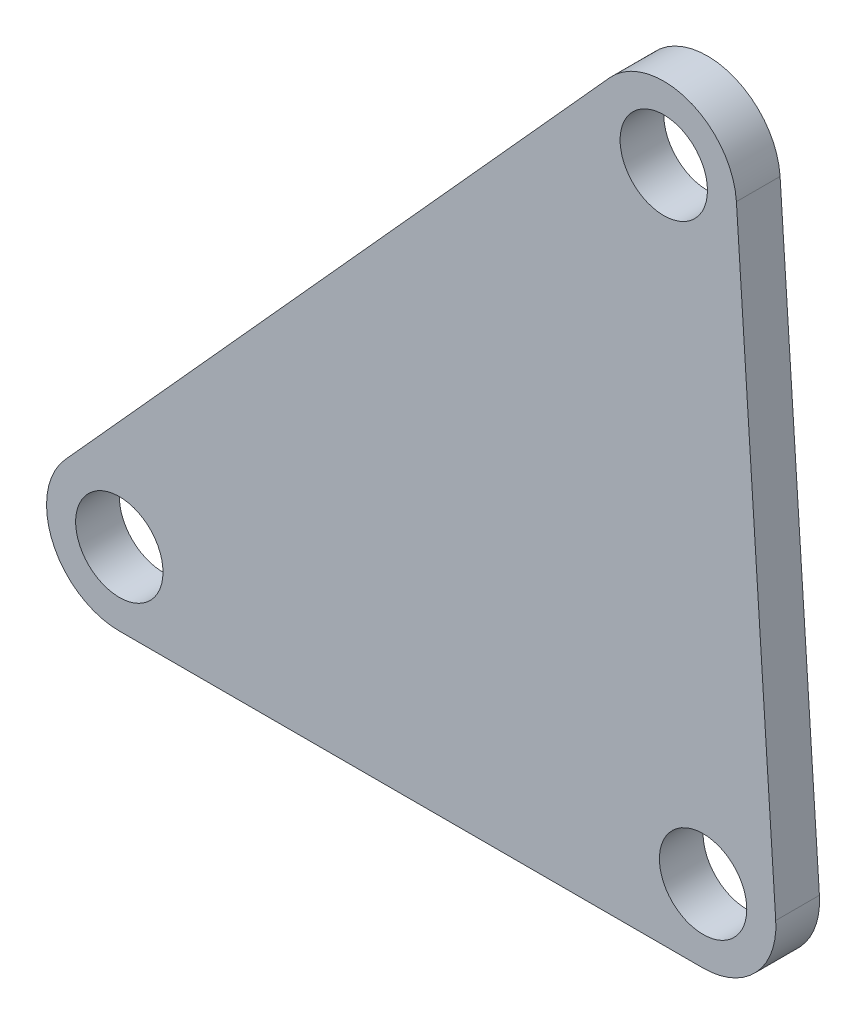
ISO-10303-21;
HEADER;
FILE_DESCRIPTION(('STEP AP214'),'2;1');
FILE_NAME('part.step','',(''),(''),'','','');
FILE_SCHEMA(('AUTOMOTIVE_DESIGN { 1 0 10303 214 1 1 1 1 }'));
ENDSEC;
DATA;
#1=APPLICATION_CONTEXT('core data for automotive mechanical design processes');
#2=APPLICATION_PROTOCOL_DEFINITION('international standard','automotive_design',2000,#1);
#3=PRODUCT_CONTEXT('',#1,'mechanical');
#4=PRODUCT('Part','Part','',(#3));
#5=PRODUCT_RELATED_PRODUCT_CATEGORY('part','',(#4));
#6=PRODUCT_DEFINITION_FORMATION('','',#4);
#7=PRODUCT_DEFINITION_CONTEXT('part definition',#1,'design');
#8=PRODUCT_DEFINITION('design','',#6,#7);
#9=PRODUCT_DEFINITION_SHAPE('','',#8);
#10=(LENGTH_UNIT() NAMED_UNIT(*) SI_UNIT(.MILLI.,.METRE.));
#11=(NAMED_UNIT(*) PLANE_ANGLE_UNIT() SI_UNIT($,.RADIAN.));
#12=(NAMED_UNIT(*) SI_UNIT($,.STERADIAN.) SOLID_ANGLE_UNIT());
#13=UNCERTAINTY_MEASURE_WITH_UNIT(LENGTH_MEASURE(1.E-05),#10,'distance_accuracy_value','');
#14=(GEOMETRIC_REPRESENTATION_CONTEXT(3) GLOBAL_UNCERTAINTY_ASSIGNED_CONTEXT((#13)) GLOBAL_UNIT_ASSIGNED_CONTEXT((#10,
#11,#12)) REPRESENTATION_CONTEXT('',''));
#15=CARTESIAN_POINT('',(0.,0.,0.));
#16=DIRECTION('',(0.,0.,1.));
#17=DIRECTION('',(1.,0.,0.));
#18=AXIS2_PLACEMENT_3D('',#15,#16,#17);
#19=CARTESIAN_POINT('',(0.,0.,3.));
#20=DIRECTION('',(0.,0.,-1.));
#21=DIRECTION('',(-1.,0.,0.));
#22=AXIS2_PLACEMENT_3D('',#19,#20,#21);
#23=PLANE('',#22);
#24=DIRECTION('',(1.,0.,0.));
#25=VECTOR('',#24,1.);
#26=CARTESIAN_POINT('',(-51.3526536867669,-5.00000000000001,3.));
#27=LINE('',#26,#25);
#28=CARTESIAN_POINT('',(-40.1,-5.00000000000001,3.));
#29=VERTEX_POINT('',#28);
#30=CARTESIAN_POINT('',(0.,-5.00000000000001,3.));
#31=VERTEX_POINT('',#30);
#32=EDGE_CURVE('E121',#29,#31,#27,.T.);
#33=ORIENTED_EDGE('',*,*,#32,.T.);
#34=CARTESIAN_POINT('',(0.,0.,3.));
#35=DIRECTION('',(0.,0.,-1.));
#36=DIRECTION('',(-1.,0.,0.));
#37=AXIS2_PLACEMENT_3D('',#34,#35,#36);
#38=CIRCLE('',#37,5.);
#39=CARTESIAN_POINT('',(4.98939885370401,0.325421386293294,3.));
#40=VERTEX_POINT('',#39);
#41=EDGE_CURVE('E134',#31,#40,#38,.F.);
#42=ORIENTED_EDGE('',*,*,#41,.T.);
#43=DIRECTION('',(-0.065084277258661,0.997879770740803,0.));
#44=VECTOR('',#43,1.);
#45=CARTESIAN_POINT('',(5.33673649115046,-5.00000000000001,3.));
#46=LINE('',#45,#44);
#47=CARTESIAN_POINT('',(2.28840134746958,41.7374318720366,3.));
#48=VERTEX_POINT('',#47);
#49=EDGE_CURVE('E105',#40,#48,#46,.T.);
#50=ORIENTED_EDGE('',*,*,#49,.T.);
#51=CARTESIAN_POINT('',(-2.70099750623444,41.4120104857433,3.));
#52=DIRECTION('',(0.,0.,-1.));
#53=DIRECTION('',(-1.,0.,0.));
#54=AXIS2_PLACEMENT_3D('',#51,#52,#53);
#55=CIRCLE('',#54,5.);
#56=CARTESIAN_POINT('',(-6.41175113398921,44.763175583751,3.));
#57=VERTEX_POINT('',#56);
#58=EDGE_CURVE('E53',#48,#57,#55,.F.);
#59=ORIENTED_EDGE('',*,*,#58,.T.);
#60=DIRECTION('',(-0.670233019601534,-0.742150725550956,0.));
#61=VECTOR('',#60,1.);
#62=CARTESIAN_POINT('',(1.51833495747202,53.5441800618031,3.));
#63=LINE('',#62,#61);
#64=CARTESIAN_POINT('',(-43.8107536277548,3.35116509800766,3.));
#65=VERTEX_POINT('',#64);
#66=EDGE_CURVE('E141',#57,#65,#63,.T.);
#67=ORIENTED_EDGE('',*,*,#66,.T.);
#68=CARTESIAN_POINT('',(-40.1,0.,3.));
#69=DIRECTION('',(0.,0.,-1.));
#70=DIRECTION('',(-1.,0.,0.));
#71=AXIS2_PLACEMENT_3D('',#68,#69,#70);
#72=CIRCLE('',#71,5.);
#73=EDGE_CURVE('E131',#65,#29,#72,.F.);
#74=ORIENTED_EDGE('',*,*,#73,.T.);
#75=EDGE_LOOP('',(#33,#42,#50,#59,#67,#74));
#76=FACE_BOUND('',#75,.T.);
#77=CARTESIAN_POINT('',(-2.70099750623443,41.4120104857433,3.));
#78=DIRECTION('',(0.,0.,1.));
#79=DIRECTION('',(1.,0.,0.));
#80=AXIS2_PLACEMENT_3D('',#77,#78,#79);
#81=CIRCLE('',#80,3.);
#82=CARTESIAN_POINT('',(0.299002493765577,41.4120104857433,3.));
#83=VERTEX_POINT('',#82);
#84=EDGE_CURVE('E113',#83,#83,#81,.T.);
#85=ORIENTED_EDGE('',*,*,#84,.F.);
#86=EDGE_LOOP('',(#85));
#87=FACE_BOUND('',#86,.T.);
#88=CARTESIAN_POINT('',(-40.1,0.,3.));
#89=DIRECTION('',(0.,0.,1.));
#90=DIRECTION('',(1.,0.,0.));
#91=AXIS2_PLACEMENT_3D('',#88,#89,#90);
#92=CIRCLE('',#91,3.00000000000001);
#93=CARTESIAN_POINT('',(-37.1,0.,3.));
#94=VERTEX_POINT('',#93);
#95=EDGE_CURVE('E145',#94,#94,#92,.T.);
#96=ORIENTED_EDGE('',*,*,#95,.F.);
#97=EDGE_LOOP('',(#96));
#98=FACE_BOUND('',#97,.T.);
#99=CARTESIAN_POINT('',(0.,0.,3.));
#100=DIRECTION('',(0.,0.,1.));
#101=DIRECTION('',(1.,0.,0.));
#102=AXIS2_PLACEMENT_3D('',#99,#100,#101);
#103=CIRCLE('',#102,3.);
#104=CARTESIAN_POINT('',(3.,0.,3.));
#105=VERTEX_POINT('',#104);
#106=EDGE_CURVE('E150',#105,#105,#103,.T.);
#107=ORIENTED_EDGE('',*,*,#106,.F.);
#108=EDGE_LOOP('',(#107));
#109=FACE_BOUND('',#108,.T.);
#110=ADVANCED_FACE('F32',(#76,#87,#98,#109),#23,.F.);
#111=CARTESIAN_POINT('',(0.,0.,0.));
#112=DIRECTION('',(0.,0.,-1.));
#113=DIRECTION('',(-1.,0.,0.));
#114=AXIS2_PLACEMENT_3D('',#111,#112,#113);
#115=PLANE('',#114);
#116=CARTESIAN_POINT('',(-40.1,0.,0.));
#117=DIRECTION('',(0.,0.,1.));
#118=DIRECTION('',(1.,0.,0.));
#119=AXIS2_PLACEMENT_3D('',#116,#117,#118);
#120=CIRCLE('',#119,3.00000000000001);
#121=CARTESIAN_POINT('',(-37.1,0.,0.));
#122=VERTEX_POINT('',#121);
#123=EDGE_CURVE('E147',#122,#122,#120,.T.);
#124=ORIENTED_EDGE('',*,*,#123,.T.);
#125=EDGE_LOOP('',(#124));
#126=FACE_BOUND('',#125,.T.);
#127=DIRECTION('',(-0.065084277258661,0.997879770740803,0.));
#128=VECTOR('',#127,1.);
#129=CARTESIAN_POINT('',(5.33673649115046,-5.00000000000001,0.));
#130=LINE('',#129,#128);
#131=CARTESIAN_POINT('',(4.98939885370401,0.325421386293294,0.));
#132=VERTEX_POINT('',#131);
#133=CARTESIAN_POINT('',(2.28840134746958,41.7374318720366,0.));
#134=VERTEX_POINT('',#133);
#135=EDGE_CURVE('E103',#132,#134,#130,.T.);
#136=ORIENTED_EDGE('',*,*,#135,.F.);
#137=CARTESIAN_POINT('',(0.,0.,0.));
#138=DIRECTION('',(0.,0.,-1.));
#139=DIRECTION('',(-1.,0.,0.));
#140=AXIS2_PLACEMENT_3D('',#137,#138,#139);
#141=CIRCLE('',#140,5.);
#142=CARTESIAN_POINT('',(0.,-5.00000000000001,0.));
#143=VERTEX_POINT('',#142);
#144=EDGE_CURVE('E86',#132,#143,#141,.T.);
#145=ORIENTED_EDGE('',*,*,#144,.T.);
#146=DIRECTION('',(1.,0.,0.));
#147=VECTOR('',#146,1.);
#148=CARTESIAN_POINT('',(-51.3526536867669,-5.00000000000001,0.));
#149=LINE('',#148,#147);
#150=CARTESIAN_POINT('',(-40.1,-5.00000000000001,0.));
#151=VERTEX_POINT('',#150);
#152=EDGE_CURVE('E115',#151,#143,#149,.T.);
#153=ORIENTED_EDGE('',*,*,#152,.F.);
#154=CARTESIAN_POINT('',(-40.1,0.,0.));
#155=DIRECTION('',(0.,0.,-1.));
#156=DIRECTION('',(-1.,0.,0.));
#157=AXIS2_PLACEMENT_3D('',#154,#155,#156);
#158=CIRCLE('',#157,5.);
#159=CARTESIAN_POINT('',(-43.8107536277548,3.35116509800766,0.));
#160=VERTEX_POINT('',#159);
#161=EDGE_CURVE('E106',#151,#160,#158,.T.);
#162=ORIENTED_EDGE('',*,*,#161,.T.);
#163=DIRECTION('',(-0.670233019601534,-0.742150725550956,0.));
#164=VECTOR('',#163,1.);
#165=CARTESIAN_POINT('',(1.51833495747202,53.5441800618031,0.));
#166=LINE('',#165,#164);
#167=CARTESIAN_POINT('',(-6.41175113398921,44.763175583751,0.));
#168=VERTEX_POINT('',#167);
#169=EDGE_CURVE('E112',#168,#160,#166,.T.);
#170=ORIENTED_EDGE('',*,*,#169,.F.);
#171=CARTESIAN_POINT('',(-2.70099750623444,41.4120104857433,0.));
#172=DIRECTION('',(0.,0.,-1.));
#173=DIRECTION('',(-1.,0.,0.));
#174=AXIS2_PLACEMENT_3D('',#171,#172,#173);
#175=CIRCLE('',#174,5.);
#176=EDGE_CURVE('E97',#168,#134,#175,.T.);
#177=ORIENTED_EDGE('',*,*,#176,.T.);
#178=EDGE_LOOP('',(#136,#145,#153,#162,#170,#177));
#179=FACE_BOUND('',#178,.T.);
#180=CARTESIAN_POINT('',(-2.70099750623443,41.4120104857433,0.));
#181=DIRECTION('',(0.,0.,1.));
#182=DIRECTION('',(1.,0.,0.));
#183=AXIS2_PLACEMENT_3D('',#180,#181,#182);
#184=CIRCLE('',#183,3.);
#185=CARTESIAN_POINT('',(0.299002493765577,41.4120104857433,0.));
#186=VERTEX_POINT('',#185);
#187=EDGE_CURVE('E118',#186,#186,#184,.T.);
#188=ORIENTED_EDGE('',*,*,#187,.T.);
#189=EDGE_LOOP('',(#188));
#190=FACE_BOUND('',#189,.T.);
#191=CARTESIAN_POINT('',(0.,0.,0.));
#192=DIRECTION('',(0.,0.,1.));
#193=DIRECTION('',(1.,0.,0.));
#194=AXIS2_PLACEMENT_3D('',#191,#192,#193);
#195=CIRCLE('',#194,3.);
#196=CARTESIAN_POINT('',(3.,0.,0.));
#197=VERTEX_POINT('',#196);
#198=EDGE_CURVE('E153',#197,#197,#195,.T.);
#199=ORIENTED_EDGE('',*,*,#198,.T.);
#200=EDGE_LOOP('',(#199));
#201=FACE_BOUND('',#200,.T.);
#202=ADVANCED_FACE('F109',(#126,#179,#190,#201),#115,.T.);
#203=CARTESIAN_POINT('',(5.33673649115046,-5.00000000000001,3.));
#204=DIRECTION('',(-0.997879770740803,-0.065084277258661,0.));
#205=DIRECTION('',(0.065084277258661,-0.997879770740803,0.));
#206=AXIS2_PLACEMENT_3D('',#203,#204,#205);
#207=PLANE('',#206);
#208=ORIENTED_EDGE('',*,*,#49,.F.);
#209=DIRECTION('',(0.,0.,-1.));
#210=VECTOR('',#209,1.);
#211=CARTESIAN_POINT('',(4.98939885370401,0.325421386293294,3.));
#212=LINE('',#211,#210);
#213=EDGE_CURVE('E90',#40,#132,#212,.T.);
#214=ORIENTED_EDGE('',*,*,#213,.T.);
#215=ORIENTED_EDGE('',*,*,#135,.T.);
#216=DIRECTION('',(0.,0.,-1.));
#217=VECTOR('',#216,1.);
#218=CARTESIAN_POINT('',(2.28840134746958,41.7374318720366,3.));
#219=LINE('',#218,#217);
#220=EDGE_CURVE('E107',#134,#48,#219,.F.);
#221=ORIENTED_EDGE('',*,*,#220,.T.);
#222=EDGE_LOOP('',(#208,#214,#215,#221));
#223=FACE_BOUND('',#222,.T.);
#224=ADVANCED_FACE('F102',(#223),#207,.F.);
#225=CARTESIAN_POINT('',(1.51833495747202,53.5441800618031,3.));
#226=DIRECTION('',(0.742150725550956,-0.670233019601534,0.));
#227=DIRECTION('',(0.670233019601534,0.742150725550956,0.));
#228=AXIS2_PLACEMENT_3D('',#225,#226,#227);
#229=PLANE('',#228);
#230=ORIENTED_EDGE('',*,*,#66,.F.);
#231=DIRECTION('',(0.,0.,-1.));
#232=VECTOR('',#231,1.);
#233=CARTESIAN_POINT('',(-6.41175113398921,44.763175583751,3.));
#234=LINE('',#233,#232);
#235=EDGE_CURVE('E11',#57,#168,#234,.T.);
#236=ORIENTED_EDGE('',*,*,#235,.T.);
#237=ORIENTED_EDGE('',*,*,#169,.T.);
#238=DIRECTION('',(0.,0.,-1.));
#239=VECTOR('',#238,1.);
#240=CARTESIAN_POINT('',(-43.8107536277548,3.35116509800766,3.));
#241=LINE('',#240,#239);
#242=EDGE_CURVE('E40',#160,#65,#241,.F.);
#243=ORIENTED_EDGE('',*,*,#242,.T.);
#244=EDGE_LOOP('',(#230,#236,#237,#243));
#245=FACE_BOUND('',#244,.T.);
#246=ADVANCED_FACE('F176',(#245),#229,.F.);
#247=CARTESIAN_POINT('',(-51.3526536867669,-5.00000000000001,3.));
#248=DIRECTION('',(0.,1.,0.));
#249=DIRECTION('',(-1.,0.,0.));
#250=AXIS2_PLACEMENT_3D('',#247,#248,#249);
#251=PLANE('',#250);
#252=ORIENTED_EDGE('',*,*,#152,.T.);
#253=DIRECTION('',(0.,0.,-1.));
#254=VECTOR('',#253,1.);
#255=CARTESIAN_POINT('',(0.,-5.00000000000001,3.));
#256=LINE('',#255,#254);
#257=EDGE_CURVE('E91',#143,#31,#256,.F.);
#258=ORIENTED_EDGE('',*,*,#257,.T.);
#259=ORIENTED_EDGE('',*,*,#32,.F.);
#260=DIRECTION('',(0.,0.,-1.));
#261=VECTOR('',#260,1.);
#262=CARTESIAN_POINT('',(-40.1,-5.00000000000001,3.));
#263=LINE('',#262,#261);
#264=EDGE_CURVE('E96',#29,#151,#263,.T.);
#265=ORIENTED_EDGE('',*,*,#264,.T.);
#266=EDGE_LOOP('',(#252,#258,#259,#265));
#267=FACE_BOUND('',#266,.T.);
#268=ADVANCED_FACE('F173',(#267),#251,.F.);
#269=CARTESIAN_POINT('',(-2.70099750623443,41.4120104857433,3.));
#270=DIRECTION('',(0.,0.,-1.));
#271=DIRECTION('',(-1.,0.,0.));
#272=AXIS2_PLACEMENT_3D('',#269,#270,#271);
#273=CYLINDRICAL_SURFACE('',#272,3.);
#274=ORIENTED_EDGE('',*,*,#84,.T.);
#275=EDGE_LOOP('',(#274));
#276=FACE_BOUND('',#275,.T.);
#277=ORIENTED_EDGE('',*,*,#187,.F.);
#278=EDGE_LOOP('',(#277));
#279=FACE_BOUND('',#278,.T.);
#280=ADVANCED_FACE('F170',(#276,#279),#273,.F.);
#281=CARTESIAN_POINT('',(-40.1,0.,3.));
#282=DIRECTION('',(0.,0.,-1.));
#283=DIRECTION('',(-1.,0.,0.));
#284=AXIS2_PLACEMENT_3D('',#281,#282,#283);
#285=CYLINDRICAL_SURFACE('',#284,3.00000000000001);
#286=ORIENTED_EDGE('',*,*,#95,.T.);
#287=EDGE_LOOP('',(#286));
#288=FACE_BOUND('',#287,.T.);
#289=ORIENTED_EDGE('',*,*,#123,.F.);
#290=EDGE_LOOP('',(#289));
#291=FACE_BOUND('',#290,.T.);
#292=ADVANCED_FACE('F241',(#288,#291),#285,.F.);
#293=CARTESIAN_POINT('',(0.,0.,3.));
#294=DIRECTION('',(0.,0.,-1.));
#295=DIRECTION('',(-1.,0.,0.));
#296=AXIS2_PLACEMENT_3D('',#293,#294,#295);
#297=CYLINDRICAL_SURFACE('',#296,3.);
#298=ORIENTED_EDGE('',*,*,#106,.T.);
#299=EDGE_LOOP('',(#298));
#300=FACE_BOUND('',#299,.T.);
#301=ORIENTED_EDGE('',*,*,#198,.F.);
#302=EDGE_LOOP('',(#301));
#303=FACE_BOUND('',#302,.T.);
#304=ADVANCED_FACE('F159',(#300,#303),#297,.F.);
#305=CARTESIAN_POINT('',(0.,0.,3.));
#306=DIRECTION('',(0.,0.,-1.));
#307=DIRECTION('',(-1.,0.,0.));
#308=AXIS2_PLACEMENT_3D('',#305,#306,#307);
#309=CYLINDRICAL_SURFACE('',#308,5.);
#310=ORIENTED_EDGE('',*,*,#41,.F.);
#311=ORIENTED_EDGE('',*,*,#257,.F.);
#312=ORIENTED_EDGE('',*,*,#144,.F.);
#313=ORIENTED_EDGE('',*,*,#213,.F.);
#314=EDGE_LOOP('',(#310,#311,#312,#313));
#315=FACE_BOUND('',#314,.T.);
#316=ADVANCED_FACE('F89',(#315),#309,.T.);
#317=CARTESIAN_POINT('',(-2.70099750623444,41.4120104857433,3.));
#318=DIRECTION('',(0.,0.,-1.));
#319=DIRECTION('',(-1.,0.,0.));
#320=AXIS2_PLACEMENT_3D('',#317,#318,#319);
#321=CYLINDRICAL_SURFACE('',#320,5.);
#322=ORIENTED_EDGE('',*,*,#58,.F.);
#323=ORIENTED_EDGE('',*,*,#220,.F.);
#324=ORIENTED_EDGE('',*,*,#176,.F.);
#325=ORIENTED_EDGE('',*,*,#235,.F.);
#326=EDGE_LOOP('',(#322,#323,#324,#325));
#327=FACE_BOUND('',#326,.T.);
#328=ADVANCED_FACE('F182',(#327),#321,.T.);
#329=CARTESIAN_POINT('',(-40.1,0.,3.));
#330=DIRECTION('',(0.,0.,-1.));
#331=DIRECTION('',(-1.,0.,0.));
#332=AXIS2_PLACEMENT_3D('',#329,#330,#331);
#333=CYLINDRICAL_SURFACE('',#332,5.);
#334=ORIENTED_EDGE('',*,*,#73,.F.);
#335=ORIENTED_EDGE('',*,*,#242,.F.);
#336=ORIENTED_EDGE('',*,*,#161,.F.);
#337=ORIENTED_EDGE('',*,*,#264,.F.);
#338=EDGE_LOOP('',(#334,#335,#336,#337));
#339=FACE_BOUND('',#338,.T.);
#340=ADVANCED_FACE('F34',(#339),#333,.T.);
#341=CLOSED_SHELL('',(#110,#202,#224,#246,#268,#280,#292,#304,#316,#328,#340));
#342=MANIFOLD_SOLID_BREP('B2',#341);
#343=ADVANCED_BREP_SHAPE_REPRESENTATION('',(#18,#342),#14);
#344=SHAPE_DEFINITION_REPRESENTATION(#9,#343);
ENDSEC;
END-ISO-10303-21;
